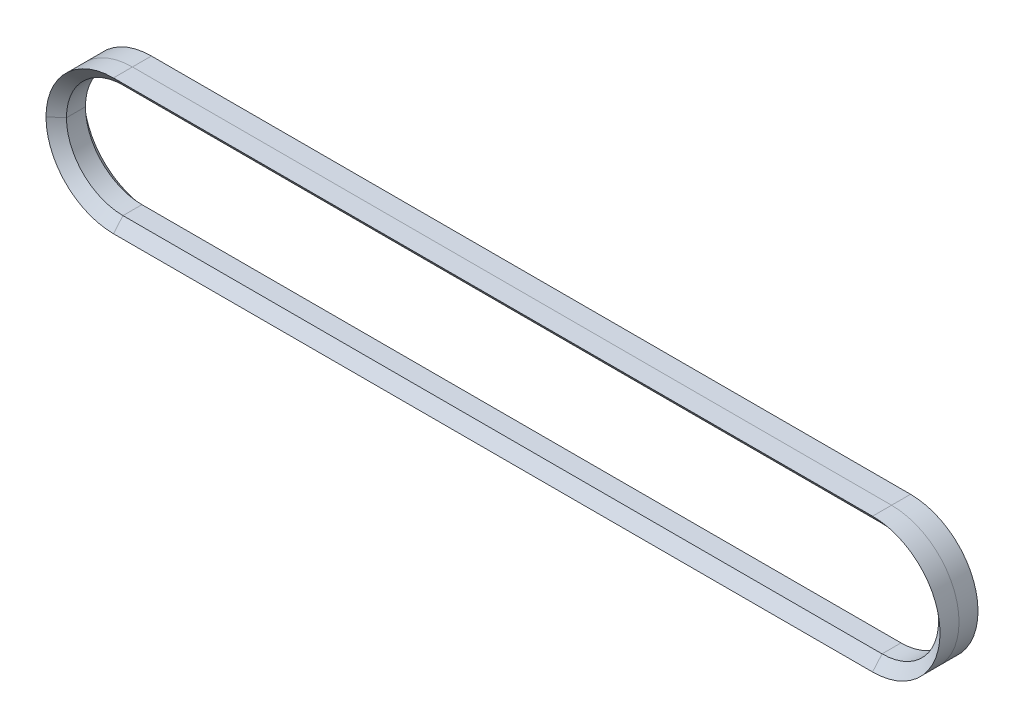
ISO-10303-21;
HEADER;
FILE_DESCRIPTION(('STEP AP214'),'2;1');
FILE_NAME('part.step','',(''),(''),'','','');
FILE_SCHEMA(('AUTOMOTIVE_DESIGN { 1 0 10303 214 1 1 1 1 }'));
ENDSEC;
DATA;
#1=APPLICATION_CONTEXT('core data for automotive mechanical design processes');
#2=APPLICATION_PROTOCOL_DEFINITION('international standard','automotive_design',2000,#1);
#3=PRODUCT_CONTEXT('',#1,'mechanical');
#4=PRODUCT('Part','Part','',(#3));
#5=PRODUCT_RELATED_PRODUCT_CATEGORY('part','',(#4));
#6=PRODUCT_DEFINITION_FORMATION('','',#4);
#7=PRODUCT_DEFINITION_CONTEXT('part definition',#1,'design');
#8=PRODUCT_DEFINITION('design','',#6,#7);
#9=PRODUCT_DEFINITION_SHAPE('','',#8);
#10=(LENGTH_UNIT() NAMED_UNIT(*) SI_UNIT(.MILLI.,.METRE.));
#11=(NAMED_UNIT(*) PLANE_ANGLE_UNIT() SI_UNIT($,.RADIAN.));
#12=(NAMED_UNIT(*) SI_UNIT($,.STERADIAN.) SOLID_ANGLE_UNIT());
#13=UNCERTAINTY_MEASURE_WITH_UNIT(LENGTH_MEASURE(1.E-05),#10,'distance_accuracy_value','');
#14=(GEOMETRIC_REPRESENTATION_CONTEXT(3) GLOBAL_UNCERTAINTY_ASSIGNED_CONTEXT((#13)) GLOBAL_UNIT_ASSIGNED_CONTEXT((#10,
#11,#12)) REPRESENTATION_CONTEXT('',''));
#15=CARTESIAN_POINT('',(0.,0.,0.));
#16=DIRECTION('',(0.,0.,1.));
#17=DIRECTION('',(1.,0.,0.));
#18=AXIS2_PLACEMENT_3D('',#15,#16,#17);
#19=CARTESIAN_POINT('',(-90.,0.,0.));
#20=DIRECTION('',(0.,0.,-1.));
#21=DIRECTION('',(-1.,0.,0.));
#22=AXIS2_PLACEMENT_3D('',#19,#20,#21);
#23=CYLINDRICAL_SURFACE('',#22,16.);
#24=CARTESIAN_POINT('',(-90.,0.,0.));
#25=DIRECTION('',(0.,0.,-1.));
#26=DIRECTION('',(0.,-1.,0.));
#27=AXIS2_PLACEMENT_3D('',#24,#25,#26);
#28=CIRCLE('',#27,16.);
#29=CARTESIAN_POINT('',(-89.9999999999999,-15.9999999999999,0.));
#30=VERTEX_POINT('',#29);
#31=CARTESIAN_POINT('',(-106.,0.,0.));
#32=VERTEX_POINT('',#31);
#33=EDGE_CURVE('E11',#30,#32,#28,.T.);
#34=ORIENTED_EDGE('',*,*,#33,.F.);
#35=DIRECTION('',(0.,0.,1.));
#36=VECTOR('',#35,1.);
#37=CARTESIAN_POINT('',(-89.9999999999999,-15.9999999999999,0.));
#38=LINE('',#37,#36);
#39=CARTESIAN_POINT('',(-89.9999999999999,-15.9999999999999,4.5));
#40=VERTEX_POINT('',#39);
#41=EDGE_CURVE('E38',#30,#40,#38,.T.);
#42=ORIENTED_EDGE('',*,*,#41,.T.);
#43=CARTESIAN_POINT('',(-90.,0.,4.5));
#44=DIRECTION('',(0.,0.,-1.));
#45=DIRECTION('',(0.,-1.,0.));
#46=AXIS2_PLACEMENT_3D('',#43,#44,#45);
#47=CIRCLE('',#46,16.);
#48=CARTESIAN_POINT('',(-106.,0.,4.5));
#49=VERTEX_POINT('',#48);
#50=EDGE_CURVE('E153',#40,#49,#47,.T.);
#51=ORIENTED_EDGE('',*,*,#50,.T.);
#52=DIRECTION('',(0.,0.,1.));
#53=VECTOR('',#52,1.);
#54=CARTESIAN_POINT('',(-106.,0.,0.));
#55=LINE('',#54,#53);
#56=EDGE_CURVE('E156',#32,#49,#55,.T.);
#57=ORIENTED_EDGE('',*,*,#56,.F.);
#58=EDGE_LOOP('',(#34,#42,#51,#57));
#59=FACE_BOUND('',#58,.T.);
#60=ADVANCED_FACE('F35',(#59),#23,.T.);
#61=CARTESIAN_POINT('',(-90.,0.,0.));
#62=DIRECTION('',(0.,0.,-1.));
#63=DIRECTION('',(-1.,0.,0.));
#64=AXIS2_PLACEMENT_3D('',#61,#62,#63);
#65=CYLINDRICAL_SURFACE('',#64,16.);
#66=CARTESIAN_POINT('',(-90.,0.,-4.5));
#67=DIRECTION('',(0.,0.,-1.));
#68=DIRECTION('',(0.,-1.,0.));
#69=AXIS2_PLACEMENT_3D('',#66,#67,#68);
#70=CIRCLE('',#69,16.);
#71=CARTESIAN_POINT('',(-89.9999999999999,-15.9999999999999,-4.5));
#72=VERTEX_POINT('',#71);
#73=CARTESIAN_POINT('',(-106.,0.,-4.5));
#74=VERTEX_POINT('',#73);
#75=EDGE_CURVE('E43',#72,#74,#70,.T.);
#76=ORIENTED_EDGE('',*,*,#75,.F.);
#77=DIRECTION('',(0.,0.,1.));
#78=VECTOR('',#77,1.);
#79=CARTESIAN_POINT('',(-89.9999999999999,-15.9999999999999,0.));
#80=LINE('',#79,#78);
#81=EDGE_CURVE('E264',#72,#30,#80,.T.);
#82=ORIENTED_EDGE('',*,*,#81,.T.);
#83=ORIENTED_EDGE('',*,*,#33,.T.);
#84=DIRECTION('',(0.,0.,1.));
#85=VECTOR('',#84,1.);
#86=CARTESIAN_POINT('',(-106.,0.,0.));
#87=LINE('',#86,#85);
#88=EDGE_CURVE('E181',#74,#32,#87,.T.);
#89=ORIENTED_EDGE('',*,*,#88,.F.);
#90=EDGE_LOOP('',(#76,#82,#83,#89));
#91=FACE_BOUND('',#90,.T.);
#92=ADVANCED_FACE('F314',(#91),#65,.T.);
#93=CARTESIAN_POINT('',(-90.,0.,-2.25));
#94=DIRECTION('',(0.,0.,-1.));
#95=DIRECTION('',(-1.,0.,0.));
#96=AXIS2_PLACEMENT_3D('',#93,#94,#95);
#97=CONICAL_SURFACE('',#96,13.4,0.857438228784277);
#98=CARTESIAN_POINT('',(-90.,0.,-2.25));
#99=DIRECTION('',(0.,0.,-1.));
#100=DIRECTION('',(0.,-1.,0.));
#101=AXIS2_PLACEMENT_3D('',#98,#99,#100);
#102=CIRCLE('',#101,13.4);
#103=CARTESIAN_POINT('',(-89.9999999999999,-13.3999999999999,-2.25));
#104=VERTEX_POINT('',#103);
#105=CARTESIAN_POINT('',(-103.4,0.,-2.25));
#106=VERTEX_POINT('',#105);
#107=EDGE_CURVE('E222',#104,#106,#102,.T.);
#108=ORIENTED_EDGE('',*,*,#107,.F.);
#109=DIRECTION('',(0.,-0.756168682462778,-0.654376744438941));
#110=VECTOR('',#109,1.);
#111=CARTESIAN_POINT('',(-89.9999999999999,-15.9999999999999,-4.5));
#112=LINE('',#111,#110);
#113=EDGE_CURVE('E241',#104,#72,#112,.T.);
#114=ORIENTED_EDGE('',*,*,#113,.T.);
#115=ORIENTED_EDGE('',*,*,#75,.T.);
#116=DIRECTION('',(-0.756168682462778,0.,-0.654376744438941));
#117=VECTOR('',#116,1.);
#118=CARTESIAN_POINT('',(-106.,0.,-4.5));
#119=LINE('',#118,#117);
#120=EDGE_CURVE('E188',#106,#74,#119,.T.);
#121=ORIENTED_EDGE('',*,*,#120,.F.);
#122=EDGE_LOOP('',(#108,#114,#115,#121));
#123=FACE_BOUND('',#122,.T.);
#124=ADVANCED_FACE('F318',(#123),#97,.F.);
#125=CARTESIAN_POINT('',(-90.,0.,0.));
#126=DIRECTION('',(0.,0.,-1.));
#127=DIRECTION('',(-1.,0.,0.));
#128=AXIS2_PLACEMENT_3D('',#125,#126,#127);
#129=CYLINDRICAL_SURFACE('',#128,13.4);
#130=CARTESIAN_POINT('',(-90.,0.,2.25));
#131=DIRECTION('',(0.,0.,-1.));
#132=DIRECTION('',(0.,-1.,0.));
#133=AXIS2_PLACEMENT_3D('',#130,#131,#132);
#134=CIRCLE('',#133,13.4);
#135=CARTESIAN_POINT('',(-89.9999999999999,-13.3999999999999,2.25));
#136=VERTEX_POINT('',#135);
#137=CARTESIAN_POINT('',(-103.4,0.,2.25));
#138=VERTEX_POINT('',#137);
#139=EDGE_CURVE('E162',#136,#138,#134,.T.);
#140=ORIENTED_EDGE('',*,*,#139,.F.);
#141=DIRECTION('',(0.,0.,-1.));
#142=VECTOR('',#141,1.);
#143=CARTESIAN_POINT('',(-89.9999999999999,-13.3999999999999,-2.25));
#144=LINE('',#143,#142);
#145=EDGE_CURVE('E218',#136,#104,#144,.T.);
#146=ORIENTED_EDGE('',*,*,#145,.T.);
#147=ORIENTED_EDGE('',*,*,#107,.T.);
#148=DIRECTION('',(0.,0.,-1.));
#149=VECTOR('',#148,1.);
#150=CARTESIAN_POINT('',(-103.4,0.,-2.25));
#151=LINE('',#150,#149);
#152=EDGE_CURVE('E185',#138,#106,#151,.T.);
#153=ORIENTED_EDGE('',*,*,#152,.F.);
#154=EDGE_LOOP('',(#140,#146,#147,#153));
#155=FACE_BOUND('',#154,.T.);
#156=ADVANCED_FACE('F323',(#155),#129,.F.);
#157=CARTESIAN_POINT('',(90.,-16.,0.));
#158=DIRECTION('',(0.,-1.,0.));
#159=DIRECTION('',(1.,0.,0.));
#160=AXIS2_PLACEMENT_3D('',#157,#158,#159);
#161=PLANE('',#160);
#162=ORIENTED_EDGE('',*,*,#41,.F.);
#163=DIRECTION('',(-1.,0.,0.));
#164=VECTOR('',#163,1.);
#165=CARTESIAN_POINT('',(90.,-16.,0.));
#166=LINE('',#165,#164);
#167=CARTESIAN_POINT('',(90.,-16.,0.));
#168=VERTEX_POINT('',#167);
#169=EDGE_CURVE('E278',#168,#30,#166,.T.);
#170=ORIENTED_EDGE('',*,*,#169,.F.);
#171=DIRECTION('',(0.,0.,1.));
#172=VECTOR('',#171,1.);
#173=CARTESIAN_POINT('',(90.,-16.,0.));
#174=LINE('',#173,#172);
#175=CARTESIAN_POINT('',(90.,-16.,4.5));
#176=VERTEX_POINT('',#175);
#177=EDGE_CURVE('E221',#168,#176,#174,.T.);
#178=ORIENTED_EDGE('',*,*,#177,.T.);
#179=DIRECTION('',(-1.,0.,0.));
#180=VECTOR('',#179,1.);
#181=CARTESIAN_POINT('',(90.,-16.,4.5));
#182=LINE('',#181,#180);
#183=EDGE_CURVE('E215',#176,#40,#182,.T.);
#184=ORIENTED_EDGE('',*,*,#183,.T.);
#185=EDGE_LOOP('',(#162,#170,#178,#184));
#186=FACE_BOUND('',#185,.T.);
#187=ADVANCED_FACE('F288',(#186),#161,.T.);
#188=CARTESIAN_POINT('',(90.,-16.,0.));
#189=DIRECTION('',(0.,-1.,0.));
#190=DIRECTION('',(1.,0.,0.));
#191=AXIS2_PLACEMENT_3D('',#188,#189,#190);
#192=PLANE('',#191);
#193=ORIENTED_EDGE('',*,*,#169,.T.);
#194=ORIENTED_EDGE('',*,*,#81,.F.);
#195=DIRECTION('',(-1.,0.,0.));
#196=VECTOR('',#195,1.);
#197=CARTESIAN_POINT('',(90.,-16.,-4.5));
#198=LINE('',#197,#196);
#199=CARTESIAN_POINT('',(90.,-16.,-4.5));
#200=VERTEX_POINT('',#199);
#201=EDGE_CURVE('E261',#200,#72,#198,.T.);
#202=ORIENTED_EDGE('',*,*,#201,.F.);
#203=DIRECTION('',(0.,0.,1.));
#204=VECTOR('',#203,1.);
#205=CARTESIAN_POINT('',(90.,-16.,0.));
#206=LINE('',#205,#204);
#207=EDGE_CURVE('E257',#200,#168,#206,.T.);
#208=ORIENTED_EDGE('',*,*,#207,.T.);
#209=EDGE_LOOP('',(#193,#194,#202,#208));
#210=FACE_BOUND('',#209,.T.);
#211=ADVANCED_FACE('F328',(#210),#192,.T.);
#212=CARTESIAN_POINT('',(90.,-16.,-4.5));
#213=DIRECTION('',(0.,0.654376744438941,-0.756168682462778));
#214=DIRECTION('',(0.,0.756168682462778,0.654376744438941));
#215=AXIS2_PLACEMENT_3D('',#212,#213,#214);
#216=PLANE('',#215);
#217=ORIENTED_EDGE('',*,*,#201,.T.);
#218=ORIENTED_EDGE('',*,*,#113,.F.);
#219=DIRECTION('',(-1.,0.,0.));
#220=VECTOR('',#219,1.);
#221=CARTESIAN_POINT('',(90.,-13.4,-2.25));
#222=LINE('',#221,#220);
#223=CARTESIAN_POINT('',(90.,-13.4,-2.25));
#224=VERTEX_POINT('',#223);
#225=EDGE_CURVE('E238',#224,#104,#222,.T.);
#226=ORIENTED_EDGE('',*,*,#225,.F.);
#227=DIRECTION('',(0.,-0.756168682462778,-0.654376744438941));
#228=VECTOR('',#227,1.);
#229=CARTESIAN_POINT('',(90.,-16.,-4.5));
#230=LINE('',#229,#228);
#231=EDGE_CURVE('E234',#224,#200,#230,.T.);
#232=ORIENTED_EDGE('',*,*,#231,.T.);
#233=EDGE_LOOP('',(#217,#218,#226,#232));
#234=FACE_BOUND('',#233,.T.);
#235=ADVANCED_FACE('F345',(#234),#216,.T.);
#236=CARTESIAN_POINT('',(90.,-13.4,-2.25));
#237=DIRECTION('',(0.,1.,0.));
#238=DIRECTION('',(-1.,0.,0.));
#239=AXIS2_PLACEMENT_3D('',#236,#237,#238);
#240=PLANE('',#239);
#241=ORIENTED_EDGE('',*,*,#225,.T.);
#242=ORIENTED_EDGE('',*,*,#145,.F.);
#243=DIRECTION('',(-1.,0.,0.));
#244=VECTOR('',#243,1.);
#245=CARTESIAN_POINT('',(90.,-13.4,2.25));
#246=LINE('',#245,#244);
#247=CARTESIAN_POINT('',(90.,-13.4,2.25));
#248=VERTEX_POINT('',#247);
#249=EDGE_CURVE('E214',#248,#136,#246,.T.);
#250=ORIENTED_EDGE('',*,*,#249,.F.);
#251=DIRECTION('',(0.,0.,-1.));
#252=VECTOR('',#251,1.);
#253=CARTESIAN_POINT('',(90.,-13.4,-2.25));
#254=LINE('',#253,#252);
#255=EDGE_CURVE('E207',#248,#224,#254,.T.);
#256=ORIENTED_EDGE('',*,*,#255,.T.);
#257=EDGE_LOOP('',(#241,#242,#250,#256));
#258=FACE_BOUND('',#257,.T.);
#259=ADVANCED_FACE('F298',(#258),#240,.T.);
#260=CARTESIAN_POINT('',(90.,-13.4,2.25));
#261=DIRECTION('',(0.,0.654376744438941,0.756168682462778));
#262=DIRECTION('',(0.,-0.756168682462778,0.654376744438941));
#263=AXIS2_PLACEMENT_3D('',#260,#261,#262);
#264=PLANE('',#263);
#265=ORIENTED_EDGE('',*,*,#249,.T.);
#266=DIRECTION('',(0.,0.756168682462778,-0.654376744438941));
#267=VECTOR('',#266,1.);
#268=CARTESIAN_POINT('',(-89.9999999999999,-13.3999999999999,2.25));
#269=LINE('',#268,#267);
#270=EDGE_CURVE('E212',#40,#136,#269,.T.);
#271=ORIENTED_EDGE('',*,*,#270,.F.);
#272=ORIENTED_EDGE('',*,*,#183,.F.);
#273=DIRECTION('',(0.,0.756168682462778,-0.654376744438941));
#274=VECTOR('',#273,1.);
#275=CARTESIAN_POINT('',(90.,-13.4,2.25));
#276=LINE('',#275,#274);
#277=EDGE_CURVE('E204',#176,#248,#276,.T.);
#278=ORIENTED_EDGE('',*,*,#277,.T.);
#279=EDGE_LOOP('',(#265,#271,#272,#278));
#280=FACE_BOUND('',#279,.T.);
#281=ADVANCED_FACE('F295',(#280),#264,.T.);
#282=CARTESIAN_POINT('',(90.,0.,0.));
#283=DIRECTION('',(0.,0.,-1.));
#284=DIRECTION('',(-1.,0.,0.));
#285=AXIS2_PLACEMENT_3D('',#282,#283,#284);
#286=CYLINDRICAL_SURFACE('',#285,16.);
#287=ORIENTED_EDGE('',*,*,#177,.F.);
#288=CARTESIAN_POINT('',(90.,0.,0.));
#289=DIRECTION('',(0.,0.,-1.));
#290=DIRECTION('',(0.,1.,0.));
#291=AXIS2_PLACEMENT_3D('',#288,#289,#290);
#292=CIRCLE('',#291,16.);
#293=CARTESIAN_POINT('',(89.9999999999997,16.,0.));
#294=VERTEX_POINT('',#293);
#295=EDGE_CURVE('E85',#294,#168,#292,.T.);
#296=ORIENTED_EDGE('',*,*,#295,.F.);
#297=DIRECTION('',(0.,0.,1.));
#298=VECTOR('',#297,1.);
#299=CARTESIAN_POINT('',(89.9999999999998,16.,0.));
#300=LINE('',#299,#298);
#301=CARTESIAN_POINT('',(89.9999999999997,16.,4.5));
#302=VERTEX_POINT('',#301);
#303=EDGE_CURVE('E211',#294,#302,#300,.T.);
#304=ORIENTED_EDGE('',*,*,#303,.T.);
#305=CARTESIAN_POINT('',(90.,0.,4.5));
#306=DIRECTION('',(0.,0.,-1.));
#307=DIRECTION('',(0.,1.,0.));
#308=AXIS2_PLACEMENT_3D('',#305,#306,#307);
#309=CIRCLE('',#308,16.);
#310=EDGE_CURVE('E209',#302,#176,#309,.T.);
#311=ORIENTED_EDGE('',*,*,#310,.T.);
#312=EDGE_LOOP('',(#287,#296,#304,#311));
#313=FACE_BOUND('',#312,.T.);
#314=ADVANCED_FACE('F338',(#313),#286,.T.);
#315=CARTESIAN_POINT('',(90.,0.,0.));
#316=DIRECTION('',(0.,0.,-1.));
#317=DIRECTION('',(-1.,0.,0.));
#318=AXIS2_PLACEMENT_3D('',#315,#316,#317);
#319=CYLINDRICAL_SURFACE('',#318,16.);
#320=ORIENTED_EDGE('',*,*,#295,.T.);
#321=ORIENTED_EDGE('',*,*,#207,.F.);
#322=CARTESIAN_POINT('',(90.,0.,-4.5));
#323=DIRECTION('',(0.,0.,-1.));
#324=DIRECTION('',(0.,1.,0.));
#325=AXIS2_PLACEMENT_3D('',#322,#323,#324);
#326=CIRCLE('',#325,16.);
#327=CARTESIAN_POINT('',(89.9999999999997,16.,-4.5));
#328=VERTEX_POINT('',#327);
#329=EDGE_CURVE('E95',#328,#200,#326,.T.);
#330=ORIENTED_EDGE('',*,*,#329,.F.);
#331=DIRECTION('',(0.,0.,1.));
#332=VECTOR('',#331,1.);
#333=CARTESIAN_POINT('',(89.9999999999998,16.,0.));
#334=LINE('',#333,#332);
#335=EDGE_CURVE('E254',#328,#294,#334,.T.);
#336=ORIENTED_EDGE('',*,*,#335,.T.);
#337=EDGE_LOOP('',(#320,#321,#330,#336));
#338=FACE_BOUND('',#337,.T.);
#339=ADVANCED_FACE('F309',(#338),#319,.T.);
#340=CARTESIAN_POINT('',(90.,0.,-2.25));
#341=DIRECTION('',(0.,0.,-1.));
#342=DIRECTION('',(-1.,0.,0.));
#343=AXIS2_PLACEMENT_3D('',#340,#341,#342);
#344=CONICAL_SURFACE('',#343,13.4,0.857438228784277);
#345=ORIENTED_EDGE('',*,*,#329,.T.);
#346=ORIENTED_EDGE('',*,*,#231,.F.);
#347=CARTESIAN_POINT('',(90.,0.,-2.25));
#348=DIRECTION('',(0.,0.,-1.));
#349=DIRECTION('',(0.,1.,0.));
#350=AXIS2_PLACEMENT_3D('',#347,#348,#349);
#351=CIRCLE('',#350,13.4);
#352=CARTESIAN_POINT('',(89.9999999999997,13.4,-2.25));
#353=VERTEX_POINT('',#352);
#354=EDGE_CURVE('E104',#353,#224,#351,.T.);
#355=ORIENTED_EDGE('',*,*,#354,.F.);
#356=DIRECTION('',(0.,0.756168682462778,-0.654376744438941));
#357=VECTOR('',#356,1.);
#358=CARTESIAN_POINT('',(89.9999999999998,16.,-4.5));
#359=LINE('',#358,#357);
#360=EDGE_CURVE('E231',#353,#328,#359,.T.);
#361=ORIENTED_EDGE('',*,*,#360,.T.);
#362=EDGE_LOOP('',(#345,#346,#355,#361));
#363=FACE_BOUND('',#362,.T.);
#364=ADVANCED_FACE('F301',(#363),#344,.F.);
#365=CARTESIAN_POINT('',(90.,0.,0.));
#366=DIRECTION('',(0.,0.,-1.));
#367=DIRECTION('',(-1.,0.,0.));
#368=AXIS2_PLACEMENT_3D('',#365,#366,#367);
#369=CYLINDRICAL_SURFACE('',#368,13.4);
#370=ORIENTED_EDGE('',*,*,#354,.T.);
#371=ORIENTED_EDGE('',*,*,#255,.F.);
#372=CARTESIAN_POINT('',(90.,0.,2.25));
#373=DIRECTION('',(0.,0.,-1.));
#374=DIRECTION('',(0.,1.,0.));
#375=AXIS2_PLACEMENT_3D('',#372,#373,#374);
#376=CIRCLE('',#375,13.4);
#377=CARTESIAN_POINT('',(89.9999999999997,13.4,2.25));
#378=VERTEX_POINT('',#377);
#379=EDGE_CURVE('E121',#378,#248,#376,.T.);
#380=ORIENTED_EDGE('',*,*,#379,.F.);
#381=DIRECTION('',(0.,0.,-1.));
#382=VECTOR('',#381,1.);
#383=CARTESIAN_POINT('',(89.9999999999998,13.4,-2.25));
#384=LINE('',#383,#382);
#385=EDGE_CURVE('E200',#378,#353,#384,.T.);
#386=ORIENTED_EDGE('',*,*,#385,.T.);
#387=EDGE_LOOP('',(#370,#371,#380,#386));
#388=FACE_BOUND('',#387,.T.);
#389=ADVANCED_FACE('F299',(#388),#369,.F.);
#390=CARTESIAN_POINT('',(90.,0.,4.5));
#391=DIRECTION('',(0.,0.,1.));
#392=DIRECTION('',(1.,0.,0.));
#393=AXIS2_PLACEMENT_3D('',#390,#391,#392);
#394=CONICAL_SURFACE('',#393,16.,0.857438228784277);
#395=ORIENTED_EDGE('',*,*,#379,.T.);
#396=ORIENTED_EDGE('',*,*,#277,.F.);
#397=ORIENTED_EDGE('',*,*,#310,.F.);
#398=DIRECTION('',(0.,-0.756168682462778,-0.654376744438941));
#399=VECTOR('',#398,1.);
#400=CARTESIAN_POINT('',(89.9999999999998,13.4,2.25));
#401=LINE('',#400,#399);
#402=EDGE_CURVE('E195',#302,#378,#401,.T.);
#403=ORIENTED_EDGE('',*,*,#402,.T.);
#404=EDGE_LOOP('',(#395,#396,#397,#403));
#405=FACE_BOUND('',#404,.T.);
#406=ADVANCED_FACE('F292',(#405),#394,.F.);
#407=CARTESIAN_POINT('',(-90.0000000000001,16.,0.));
#408=DIRECTION('',(0.,1.,0.));
#409=DIRECTION('',(0.,0.,1.));
#410=AXIS2_PLACEMENT_3D('',#407,#408,#409);
#411=PLANE('',#410);
#412=ORIENTED_EDGE('',*,*,#303,.F.);
#413=DIRECTION('',(1.,0.,0.));
#414=VECTOR('',#413,1.);
#415=CARTESIAN_POINT('',(-90.0000000000001,16.,0.));
#416=LINE('',#415,#414);
#417=CARTESIAN_POINT('',(-90.0000000000001,16.,0.));
#418=VERTEX_POINT('',#417);
#419=EDGE_CURVE('E271',#418,#294,#416,.T.);
#420=ORIENTED_EDGE('',*,*,#419,.F.);
#421=DIRECTION('',(0.,0.,1.));
#422=VECTOR('',#421,1.);
#423=CARTESIAN_POINT('',(-90.0000000000001,16.,0.));
#424=LINE('',#423,#422);
#425=CARTESIAN_POINT('',(-90.0000000000001,16.,4.5));
#426=VERTEX_POINT('',#425);
#427=EDGE_CURVE('E203',#418,#426,#424,.T.);
#428=ORIENTED_EDGE('',*,*,#427,.T.);
#429=DIRECTION('',(1.,0.,0.));
#430=VECTOR('',#429,1.);
#431=CARTESIAN_POINT('',(-90.0000000000001,16.,4.5));
#432=LINE('',#431,#430);
#433=EDGE_CURVE('E198',#426,#302,#432,.T.);
#434=ORIENTED_EDGE('',*,*,#433,.T.);
#435=EDGE_LOOP('',(#412,#420,#428,#434));
#436=FACE_BOUND('',#435,.T.);
#437=ADVANCED_FACE('F307',(#436),#411,.T.);
#438=CARTESIAN_POINT('',(-90.0000000000001,16.,0.));
#439=DIRECTION('',(0.,1.,0.));
#440=DIRECTION('',(0.,0.,1.));
#441=AXIS2_PLACEMENT_3D('',#438,#439,#440);
#442=PLANE('',#441);
#443=ORIENTED_EDGE('',*,*,#419,.T.);
#444=ORIENTED_EDGE('',*,*,#335,.F.);
#445=DIRECTION('',(1.,0.,0.));
#446=VECTOR('',#445,1.);
#447=CARTESIAN_POINT('',(-90.0000000000001,16.,-4.5));
#448=LINE('',#447,#446);
#449=CARTESIAN_POINT('',(-90.0000000000001,16.,-4.5));
#450=VERTEX_POINT('',#449);
#451=EDGE_CURVE('E251',#450,#328,#448,.T.);
#452=ORIENTED_EDGE('',*,*,#451,.F.);
#453=DIRECTION('',(0.,0.,1.));
#454=VECTOR('',#453,1.);
#455=CARTESIAN_POINT('',(-90.0000000000001,16.,0.));
#456=LINE('',#455,#454);
#457=EDGE_CURVE('E249',#450,#418,#456,.T.);
#458=ORIENTED_EDGE('',*,*,#457,.T.);
#459=EDGE_LOOP('',(#443,#444,#452,#458));
#460=FACE_BOUND('',#459,.T.);
#461=ADVANCED_FACE('F336',(#460),#442,.T.);
#462=CARTESIAN_POINT('',(-90.0000000000001,16.,-4.5));
#463=DIRECTION('',(0.,-0.654376744438941,-0.756168682462778));
#464=DIRECTION('',(0.,0.756168682462778,-0.654376744438941));
#465=AXIS2_PLACEMENT_3D('',#462,#463,#464);
#466=PLANE('',#465);
#467=ORIENTED_EDGE('',*,*,#451,.T.);
#468=ORIENTED_EDGE('',*,*,#360,.F.);
#469=DIRECTION('',(1.,0.,0.));
#470=VECTOR('',#469,1.);
#471=CARTESIAN_POINT('',(-90.0000000000001,13.4,-2.25));
#472=LINE('',#471,#470);
#473=CARTESIAN_POINT('',(-90.0000000000001,13.4,-2.25));
#474=VERTEX_POINT('',#473);
#475=EDGE_CURVE('E138',#474,#353,#472,.T.);
#476=ORIENTED_EDGE('',*,*,#475,.F.);
#477=DIRECTION('',(0.,0.756168682462778,-0.654376744438941));
#478=VECTOR('',#477,1.);
#479=CARTESIAN_POINT('',(-90.0000000000001,16.,-4.5));
#480=LINE('',#479,#478);
#481=EDGE_CURVE('E228',#474,#450,#480,.T.);
#482=ORIENTED_EDGE('',*,*,#481,.T.);
#483=EDGE_LOOP('',(#467,#468,#476,#482));
#484=FACE_BOUND('',#483,.T.);
#485=ADVANCED_FACE('F357',(#484),#466,.T.);
#486=CARTESIAN_POINT('',(-90.0000000000001,13.4,-2.25));
#487=DIRECTION('',(0.,-1.,0.));
#488=DIRECTION('',(0.,0.,-1.));
#489=AXIS2_PLACEMENT_3D('',#486,#487,#488);
#490=PLANE('',#489);
#491=ORIENTED_EDGE('',*,*,#475,.T.);
#492=ORIENTED_EDGE('',*,*,#385,.F.);
#493=DIRECTION('',(1.,0.,0.));
#494=VECTOR('',#493,1.);
#495=CARTESIAN_POINT('',(-90.0000000000001,13.4,2.25));
#496=LINE('',#495,#494);
#497=CARTESIAN_POINT('',(-90.0000000000001,13.4,2.25));
#498=VERTEX_POINT('',#497);
#499=EDGE_CURVE('E144',#498,#378,#496,.T.);
#500=ORIENTED_EDGE('',*,*,#499,.F.);
#501=DIRECTION('',(0.,0.,-1.));
#502=VECTOR('',#501,1.);
#503=CARTESIAN_POINT('',(-90.0000000000001,13.4,-2.25));
#504=LINE('',#503,#502);
#505=EDGE_CURVE('E193',#498,#474,#504,.T.);
#506=ORIENTED_EDGE('',*,*,#505,.T.);
#507=EDGE_LOOP('',(#491,#492,#500,#506));
#508=FACE_BOUND('',#507,.T.);
#509=ADVANCED_FACE('F359',(#508),#490,.T.);
#510=CARTESIAN_POINT('',(-90.0000000000001,13.4,2.25));
#511=DIRECTION('',(0.,-0.654376744438941,0.756168682462778));
#512=DIRECTION('',(0.,-0.756168682462778,-0.654376744438941));
#513=AXIS2_PLACEMENT_3D('',#510,#511,#512);
#514=PLANE('',#513);
#515=ORIENTED_EDGE('',*,*,#499,.T.);
#516=ORIENTED_EDGE('',*,*,#402,.F.);
#517=ORIENTED_EDGE('',*,*,#433,.F.);
#518=DIRECTION('',(0.,-0.756168682462778,-0.654376744438941));
#519=VECTOR('',#518,1.);
#520=CARTESIAN_POINT('',(-90.0000000000001,13.4,2.25));
#521=LINE('',#520,#519);
#522=EDGE_CURVE('E173',#426,#498,#521,.T.);
#523=ORIENTED_EDGE('',*,*,#522,.T.);
#524=EDGE_LOOP('',(#515,#516,#517,#523));
#525=FACE_BOUND('',#524,.T.);
#526=ADVANCED_FACE('F333',(#525),#514,.T.);
#527=CARTESIAN_POINT('',(-90.,0.,0.));
#528=DIRECTION('',(0.,0.,-1.));
#529=DIRECTION('',(-1.,0.,0.));
#530=AXIS2_PLACEMENT_3D('',#527,#528,#529);
#531=CYLINDRICAL_SURFACE('',#530,16.);
#532=ORIENTED_EDGE('',*,*,#427,.F.);
#533=CARTESIAN_POINT('',(-90.,0.,0.));
#534=DIRECTION('',(0.,0.,-1.));
#535=DIRECTION('',(-1.,0.,0.));
#536=AXIS2_PLACEMENT_3D('',#533,#534,#535);
#537=CIRCLE('',#536,16.);
#538=EDGE_CURVE('E180',#32,#418,#537,.T.);
#539=ORIENTED_EDGE('',*,*,#538,.F.);
#540=ORIENTED_EDGE('',*,*,#56,.T.);
#541=CARTESIAN_POINT('',(-90.,0.,4.5));
#542=DIRECTION('',(0.,0.,-1.));
#543=DIRECTION('',(-1.,0.,0.));
#544=AXIS2_PLACEMENT_3D('',#541,#542,#543);
#545=CIRCLE('',#544,16.);
#546=EDGE_CURVE('E168',#49,#426,#545,.T.);
#547=ORIENTED_EDGE('',*,*,#546,.T.);
#548=EDGE_LOOP('',(#532,#539,#540,#547));
#549=FACE_BOUND('',#548,.T.);
#550=ADVANCED_FACE('F178',(#549),#531,.T.);
#551=CARTESIAN_POINT('',(-90.,0.,0.));
#552=DIRECTION('',(0.,0.,-1.));
#553=DIRECTION('',(-1.,0.,0.));
#554=AXIS2_PLACEMENT_3D('',#551,#552,#553);
#555=CYLINDRICAL_SURFACE('',#554,16.);
#556=ORIENTED_EDGE('',*,*,#538,.T.);
#557=ORIENTED_EDGE('',*,*,#457,.F.);
#558=CARTESIAN_POINT('',(-90.,0.,-4.5));
#559=DIRECTION('',(0.,0.,-1.));
#560=DIRECTION('',(-1.,0.,0.));
#561=AXIS2_PLACEMENT_3D('',#558,#559,#560);
#562=CIRCLE('',#561,16.);
#563=EDGE_CURVE('E246',#74,#450,#562,.T.);
#564=ORIENTED_EDGE('',*,*,#563,.F.);
#565=ORIENTED_EDGE('',*,*,#88,.T.);
#566=EDGE_LOOP('',(#556,#557,#564,#565));
#567=FACE_BOUND('',#566,.T.);
#568=ADVANCED_FACE('F332',(#567),#555,.T.);
#569=CARTESIAN_POINT('',(-90.,0.,-2.25));
#570=DIRECTION('',(0.,0.,-1.));
#571=DIRECTION('',(-1.,0.,0.));
#572=AXIS2_PLACEMENT_3D('',#569,#570,#571);
#573=CONICAL_SURFACE('',#572,13.4,0.857438228784277);
#574=ORIENTED_EDGE('',*,*,#563,.T.);
#575=ORIENTED_EDGE('',*,*,#481,.F.);
#576=CARTESIAN_POINT('',(-90.,0.,-2.25));
#577=DIRECTION('',(0.,0.,-1.));
#578=DIRECTION('',(-1.,0.,0.));
#579=AXIS2_PLACEMENT_3D('',#576,#577,#578);
#580=CIRCLE('',#579,13.4);
#581=EDGE_CURVE('E225',#106,#474,#580,.T.);
#582=ORIENTED_EDGE('',*,*,#581,.F.);
#583=ORIENTED_EDGE('',*,*,#120,.T.);
#584=EDGE_LOOP('',(#574,#575,#582,#583));
#585=FACE_BOUND('',#584,.T.);
#586=ADVANCED_FACE('F352',(#585),#573,.F.);
#587=CARTESIAN_POINT('',(-90.,0.,0.));
#588=DIRECTION('',(0.,0.,-1.));
#589=DIRECTION('',(-1.,0.,0.));
#590=AXIS2_PLACEMENT_3D('',#587,#588,#589);
#591=CYLINDRICAL_SURFACE('',#590,13.4);
#592=ORIENTED_EDGE('',*,*,#581,.T.);
#593=ORIENTED_EDGE('',*,*,#505,.F.);
#594=CARTESIAN_POINT('',(-90.,0.,2.25));
#595=DIRECTION('',(0.,0.,-1.));
#596=DIRECTION('',(-1.,0.,0.));
#597=AXIS2_PLACEMENT_3D('',#594,#595,#596);
#598=CIRCLE('',#597,13.4);
#599=EDGE_CURVE('E192',#138,#498,#598,.T.);
#600=ORIENTED_EDGE('',*,*,#599,.F.);
#601=ORIENTED_EDGE('',*,*,#152,.T.);
#602=EDGE_LOOP('',(#592,#593,#600,#601));
#603=FACE_BOUND('',#602,.T.);
#604=ADVANCED_FACE('F355',(#603),#591,.F.);
#605=CARTESIAN_POINT('',(-90.,0.,4.5));
#606=DIRECTION('',(0.,0.,1.));
#607=DIRECTION('',(1.,0.,0.));
#608=AXIS2_PLACEMENT_3D('',#605,#606,#607);
#609=CONICAL_SURFACE('',#608,16.,0.857438228784277);
#610=ORIENTED_EDGE('',*,*,#599,.T.);
#611=ORIENTED_EDGE('',*,*,#522,.F.);
#612=ORIENTED_EDGE('',*,*,#546,.F.);
#613=DIRECTION('',(0.756168682462778,0.,-0.654376744438941));
#614=VECTOR('',#613,1.);
#615=CARTESIAN_POINT('',(-103.4,0.,2.25));
#616=LINE('',#615,#614);
#617=EDGE_CURVE('E171',#49,#138,#616,.T.);
#618=ORIENTED_EDGE('',*,*,#617,.T.);
#619=EDGE_LOOP('',(#610,#611,#612,#618));
#620=FACE_BOUND('',#619,.T.);
#621=ADVANCED_FACE('F170',(#620),#609,.F.);
#622=CARTESIAN_POINT('',(-90.,0.,4.5));
#623=DIRECTION('',(0.,0.,1.));
#624=DIRECTION('',(1.,0.,0.));
#625=AXIS2_PLACEMENT_3D('',#622,#623,#624);
#626=CONICAL_SURFACE('',#625,16.,0.857438228784277);
#627=ORIENTED_EDGE('',*,*,#270,.T.);
#628=ORIENTED_EDGE('',*,*,#139,.T.);
#629=ORIENTED_EDGE('',*,*,#617,.F.);
#630=ORIENTED_EDGE('',*,*,#50,.F.);
#631=EDGE_LOOP('',(#627,#628,#629,#630));
#632=FACE_BOUND('',#631,.T.);
#633=ADVANCED_FACE('F183',(#632),#626,.F.);
#634=CLOSED_SHELL('',(#60,#92,#124,#156,#187,#211,#235,#259,#281,#314,#339,#364,#389,#406,#437,
#461,#485,#509,#526,#550,#568,#586,#604,#621,#633));
#635=MANIFOLD_SOLID_BREP('B2',#634);
#636=ADVANCED_BREP_SHAPE_REPRESENTATION('',(#18,#635),#14);
#637=SHAPE_DEFINITION_REPRESENTATION(#9,#636);
ENDSEC;
END-ISO-10303-21;
